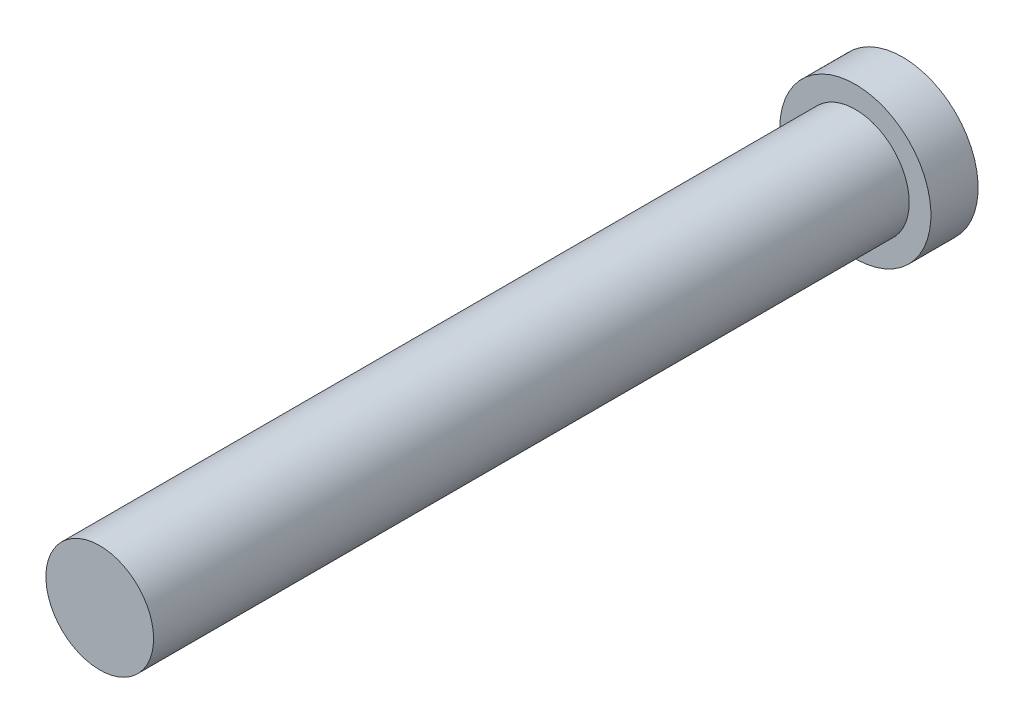
ISO-10303-21;
HEADER;
FILE_DESCRIPTION(('STEP AP214'),'2;1');
FILE_NAME('part.step','',(''),(''),'','','');
FILE_SCHEMA(('AUTOMOTIVE_DESIGN { 1 0 10303 214 1 1 1 1 }'));
ENDSEC;
DATA;
#1=APPLICATION_CONTEXT('core data for automotive mechanical design processes');
#2=APPLICATION_PROTOCOL_DEFINITION('international standard','automotive_design',2000,#1);
#3=PRODUCT_CONTEXT('',#1,'mechanical');
#4=PRODUCT('Part','Part','',(#3));
#5=PRODUCT_RELATED_PRODUCT_CATEGORY('part','',(#4));
#6=PRODUCT_DEFINITION_FORMATION('','',#4);
#7=PRODUCT_DEFINITION_CONTEXT('part definition',#1,'design');
#8=PRODUCT_DEFINITION('design','',#6,#7);
#9=PRODUCT_DEFINITION_SHAPE('','',#8);
#10=(LENGTH_UNIT() NAMED_UNIT(*) SI_UNIT(.MILLI.,.METRE.));
#11=(NAMED_UNIT(*) PLANE_ANGLE_UNIT() SI_UNIT($,.RADIAN.));
#12=(NAMED_UNIT(*) SI_UNIT($,.STERADIAN.) SOLID_ANGLE_UNIT());
#13=UNCERTAINTY_MEASURE_WITH_UNIT(LENGTH_MEASURE(1.E-05),#10,'distance_accuracy_value','');
#14=(GEOMETRIC_REPRESENTATION_CONTEXT(3) GLOBAL_UNCERTAINTY_ASSIGNED_CONTEXT((#13)) GLOBAL_UNIT_ASSIGNED_CONTEXT((#10,
#11,#12)) REPRESENTATION_CONTEXT('',''));
#15=CARTESIAN_POINT('',(0.,0.,0.));
#16=DIRECTION('',(0.,0.,1.));
#17=DIRECTION('',(1.,0.,0.));
#18=AXIS2_PLACEMENT_3D('',#15,#16,#17);
#19=CARTESIAN_POINT('',(0.,0.,-5.));
#20=DIRECTION('',(0.,0.,1.));
#21=DIRECTION('',(1.,0.,0.));
#22=AXIS2_PLACEMENT_3D('',#19,#20,#21);
#23=CYLINDRICAL_SURFACE('',#22,4.);
#24=CARTESIAN_POINT('',(0.,0.,0.));
#25=DIRECTION('',(0.,0.,-1.));
#26=DIRECTION('',(-1.,0.,0.));
#27=AXIS2_PLACEMENT_3D('',#24,#25,#26);
#28=CIRCLE('',#27,4.);
#29=CARTESIAN_POINT('',(-4.,0.,0.));
#30=VERTEX_POINT('',#29);
#31=EDGE_CURVE('E50',#30,#30,#28,.T.);
#32=ORIENTED_EDGE('',*,*,#31,.T.);
#33=EDGE_LOOP('',(#32));
#34=FACE_BOUND('',#33,.T.);
#35=CARTESIAN_POINT('',(0.,0.,-2.5));
#36=DIRECTION('',(0.,0.,-1.));
#37=DIRECTION('',(-1.,0.,0.));
#38=AXIS2_PLACEMENT_3D('',#35,#36,#37);
#39=CIRCLE('',#38,4.);
#40=CARTESIAN_POINT('',(-4.,0.,-2.5));
#41=VERTEX_POINT('',#40);
#42=EDGE_CURVE('E10',#41,#41,#39,.T.);
#43=ORIENTED_EDGE('',*,*,#42,.F.);
#44=EDGE_LOOP('',(#43));
#45=FACE_BOUND('',#44,.T.);
#46=ADVANCED_FACE('F34',(#34,#45),#23,.T.);
#47=CARTESIAN_POINT('',(0.,0.,40.));
#48=DIRECTION('',(0.,0.,-1.));
#49=DIRECTION('',(-1.,0.,0.));
#50=AXIS2_PLACEMENT_3D('',#47,#48,#49);
#51=CYLINDRICAL_SURFACE('',#50,2.85);
#52=CARTESIAN_POINT('',(0.,0.,40.));
#53=DIRECTION('',(0.,0.,1.));
#54=DIRECTION('',(1.,0.,0.));
#55=AXIS2_PLACEMENT_3D('',#52,#53,#54);
#56=CIRCLE('',#55,2.85);
#57=CARTESIAN_POINT('',(2.85,0.,40.));
#58=VERTEX_POINT('',#57);
#59=EDGE_CURVE('E41',#58,#58,#56,.T.);
#60=ORIENTED_EDGE('',*,*,#59,.F.);
#61=EDGE_LOOP('',(#60));
#62=FACE_BOUND('',#61,.T.);
#63=CARTESIAN_POINT('',(0.,0.,0.));
#64=DIRECTION('',(0.,0.,1.));
#65=DIRECTION('',(1.,0.,0.));
#66=AXIS2_PLACEMENT_3D('',#63,#64,#65);
#67=CIRCLE('',#66,2.85);
#68=CARTESIAN_POINT('',(2.85,0.,0.));
#69=VERTEX_POINT('',#68);
#70=EDGE_CURVE('E45',#69,#69,#67,.T.);
#71=ORIENTED_EDGE('',*,*,#70,.T.);
#72=EDGE_LOOP('',(#71));
#73=FACE_BOUND('',#72,.T.);
#74=ADVANCED_FACE('F36',(#62,#73),#51,.T.);
#75=CARTESIAN_POINT('',(0.,0.,40.));
#76=DIRECTION('',(0.,0.,1.));
#77=DIRECTION('',(1.,0.,0.));
#78=AXIS2_PLACEMENT_3D('',#75,#76,#77);
#79=PLANE('',#78);
#80=ORIENTED_EDGE('',*,*,#59,.T.);
#81=EDGE_LOOP('',(#80));
#82=FACE_BOUND('',#81,.T.);
#83=ADVANCED_FACE('F60',(#82),#79,.T.);
#84=CARTESIAN_POINT('',(0.,0.,0.));
#85=DIRECTION('',(0.,0.,-1.));
#86=DIRECTION('',(-1.,0.,0.));
#87=AXIS2_PLACEMENT_3D('',#84,#85,#86);
#88=PLANE('',#87);
#89=ORIENTED_EDGE('',*,*,#70,.F.);
#90=EDGE_LOOP('',(#89));
#91=FACE_BOUND('',#90,.T.);
#92=ORIENTED_EDGE('',*,*,#31,.F.);
#93=EDGE_LOOP('',(#92));
#94=FACE_BOUND('',#93,.T.);
#95=ADVANCED_FACE('F57',(#91,#94),#88,.F.);
#96=CARTESIAN_POINT('',(10.,4.,-2.5));
#97=DIRECTION('',(0.,0.,-1.));
#98=DIRECTION('',(-1.,0.,0.));
#99=AXIS2_PLACEMENT_3D('',#96,#97,#98);
#100=PLANE('',#99);
#101=ORIENTED_EDGE('',*,*,#42,.T.);
#102=EDGE_LOOP('',(#101));
#103=FACE_BOUND('',#102,.T.);
#104=ADVANCED_FACE('F59',(#103),#100,.T.);
#105=CLOSED_SHELL('',(#46,#74,#83,#95,#104));
#106=MANIFOLD_SOLID_BREP('B2',#105);
#107=ADVANCED_BREP_SHAPE_REPRESENTATION('',(#18,#106),#14);
#108=SHAPE_DEFINITION_REPRESENTATION(#9,#107);
ENDSEC;
END-ISO-10303-21;
